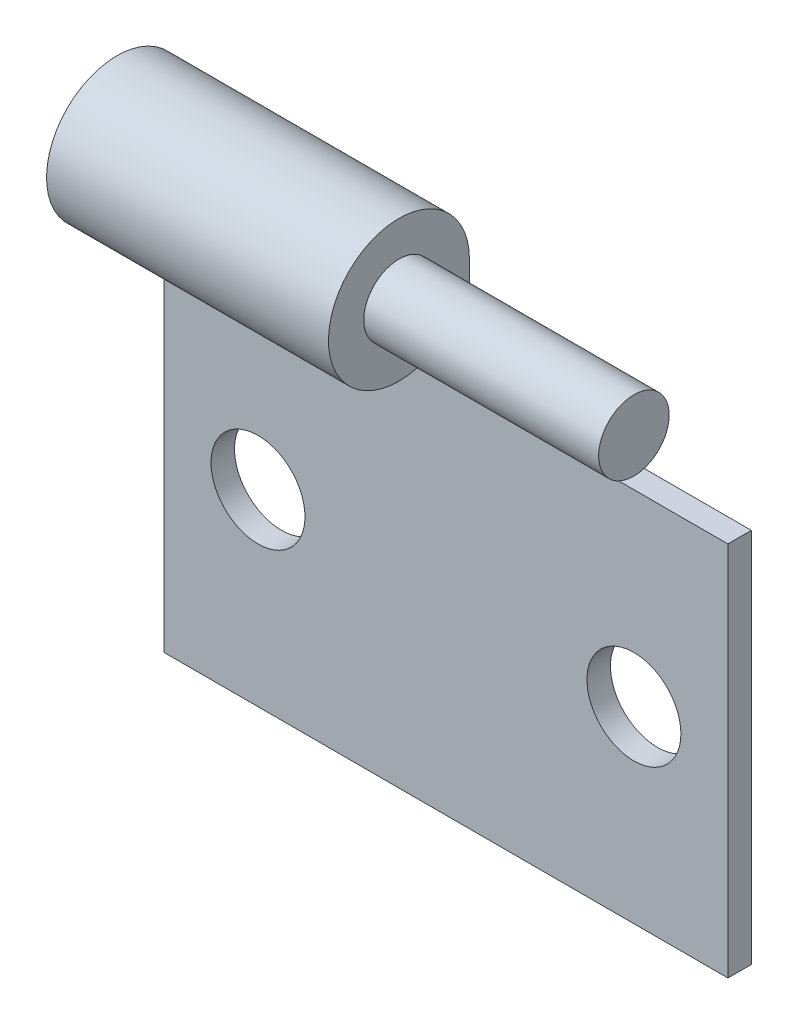
ISO-10303-21;
HEADER;
FILE_DESCRIPTION(('STEP AP214'),'2;1');
FILE_NAME('part.step','',(''),(''),'','','');
FILE_SCHEMA(('AUTOMOTIVE_DESIGN { 1 0 10303 214 1 1 1 1 }'));
ENDSEC;
DATA;
#1=APPLICATION_CONTEXT('core data for automotive mechanical design processes');
#2=APPLICATION_PROTOCOL_DEFINITION('international standard','automotive_design',2000,#1);
#3=PRODUCT_CONTEXT('',#1,'mechanical');
#4=PRODUCT('Part','Part','',(#3));
#5=PRODUCT_RELATED_PRODUCT_CATEGORY('part','',(#4));
#6=PRODUCT_DEFINITION_FORMATION('','',#4);
#7=PRODUCT_DEFINITION_CONTEXT('part definition',#1,'design');
#8=PRODUCT_DEFINITION('design','',#6,#7);
#9=PRODUCT_DEFINITION_SHAPE('','',#8);
#10=(LENGTH_UNIT() NAMED_UNIT(*) SI_UNIT(.MILLI.,.METRE.));
#11=(NAMED_UNIT(*) PLANE_ANGLE_UNIT() SI_UNIT($,.RADIAN.));
#12=(NAMED_UNIT(*) SI_UNIT($,.STERADIAN.) SOLID_ANGLE_UNIT());
#13=UNCERTAINTY_MEASURE_WITH_UNIT(LENGTH_MEASURE(1.E-05),#10,'distance_accuracy_value','');
#14=(GEOMETRIC_REPRESENTATION_CONTEXT(3) GLOBAL_UNCERTAINTY_ASSIGNED_CONTEXT((#13)) GLOBAL_UNIT_ASSIGNED_CONTEXT((#10,
#11,#12)) REPRESENTATION_CONTEXT('',''));
#15=CARTESIAN_POINT('',(0.,0.,0.));
#16=DIRECTION('',(0.,0.,1.));
#17=DIRECTION('',(1.,0.,0.));
#18=AXIS2_PLACEMENT_3D('',#15,#16,#17);
#19=CARTESIAN_POINT('',(-38.1,25.4,3.175));
#20=DIRECTION('',(0.,-1.,0.));
#21=DIRECTION('',(0.,0.,-1.));
#22=AXIS2_PLACEMENT_3D('',#19,#20,#21);
#23=PLANE('',#22);
#24=DIRECTION('',(0.,0.,-1.));
#25=VECTOR('',#24,1.);
#26=CARTESIAN_POINT('',(0.,25.4,3.175));
#27=LINE('',#26,#25);
#28=CARTESIAN_POINT('',(0.,25.4,3.175));
#29=VERTEX_POINT('',#28);
#30=CARTESIAN_POINT('',(0.,25.4,0.));
#31=VERTEX_POINT('',#30);
#32=EDGE_CURVE('E125',#29,#31,#27,.T.);
#33=ORIENTED_EDGE('',*,*,#32,.F.);
#34=DIRECTION('',(-1.,0.,0.));
#35=VECTOR('',#34,1.);
#36=CARTESIAN_POINT('',(-38.1,25.4,3.175));
#37=LINE('',#36,#35);
#38=CARTESIAN_POINT('',(38.1,25.4,3.175));
#39=VERTEX_POINT('',#38);
#40=EDGE_CURVE('E147',#39,#29,#37,.T.);
#41=ORIENTED_EDGE('',*,*,#40,.F.);
#42=DIRECTION('',(0.,0.,-1.));
#43=VECTOR('',#42,1.);
#44=CARTESIAN_POINT('',(38.1,25.4,3.175));
#45=LINE('',#44,#43);
#46=CARTESIAN_POINT('',(38.1,25.4,0.));
#47=VERTEX_POINT('',#46);
#48=EDGE_CURVE('E163',#39,#47,#45,.T.);
#49=ORIENTED_EDGE('',*,*,#48,.T.);
#50=DIRECTION('',(-1.,0.,0.));
#51=VECTOR('',#50,1.);
#52=CARTESIAN_POINT('',(-38.1,25.4,0.));
#53=LINE('',#52,#51);
#54=EDGE_CURVE('E104',#47,#31,#53,.T.);
#55=ORIENTED_EDGE('',*,*,#54,.T.);
#56=EDGE_LOOP('',(#33,#41,#49,#55));
#57=FACE_BOUND('',#56,.T.);
#58=ADVANCED_FACE('F35',(#57),#23,.F.);
#59=CARTESIAN_POINT('',(0.,0.,3.175));
#60=DIRECTION('',(0.,0.,-1.));
#61=DIRECTION('',(-1.,0.,0.));
#62=AXIS2_PLACEMENT_3D('',#59,#60,#61);
#63=PLANE('',#62);
#64=DIRECTION('',(0.,-1.,0.));
#65=VECTOR('',#64,1.);
#66=CARTESIAN_POINT('',(0.,25.4,3.175));
#67=LINE('',#66,#65);
#68=CARTESIAN_POINT('',(0.,25.8032778757914,3.175));
#69=VERTEX_POINT('',#68);
#70=EDGE_CURVE('E118',#69,#29,#67,.T.);
#71=ORIENTED_EDGE('',*,*,#70,.F.);
#72=DIRECTION('',(1.,0.,0.));
#73=VECTOR('',#72,1.);
#74=CARTESIAN_POINT('',(0.,25.8032778757914,3.175));
#75=LINE('',#74,#73);
#76=CARTESIAN_POINT('',(-38.1,25.8032778757914,3.175));
#77=VERTEX_POINT('',#76);
#78=EDGE_CURVE('E50',#69,#77,#75,.F.);
#79=ORIENTED_EDGE('',*,*,#78,.T.);
#80=DIRECTION('',(0.,-1.,0.));
#81=VECTOR('',#80,1.);
#82=CARTESIAN_POINT('',(-38.1,-25.4,3.175));
#83=LINE('',#82,#81);
#84=CARTESIAN_POINT('',(-38.1,-25.4,3.175));
#85=VERTEX_POINT('',#84);
#86=EDGE_CURVE('E150',#77,#85,#83,.T.);
#87=ORIENTED_EDGE('',*,*,#86,.T.);
#88=DIRECTION('',(1.,0.,0.));
#89=VECTOR('',#88,1.);
#90=CARTESIAN_POINT('',(-38.1,-25.4,3.175));
#91=LINE('',#90,#89);
#92=CARTESIAN_POINT('',(38.1,-25.4,3.175));
#93=VERTEX_POINT('',#92);
#94=EDGE_CURVE('E152',#85,#93,#91,.T.);
#95=ORIENTED_EDGE('',*,*,#94,.T.);
#96=DIRECTION('',(0.,1.,0.));
#97=VECTOR('',#96,1.);
#98=CARTESIAN_POINT('',(38.1,-25.4,3.175));
#99=LINE('',#98,#97);
#100=EDGE_CURVE('E144',#93,#39,#99,.T.);
#101=ORIENTED_EDGE('',*,*,#100,.T.);
#102=ORIENTED_EDGE('',*,*,#40,.T.);
#103=EDGE_LOOP('',(#71,#79,#87,#95,#101,#102));
#104=FACE_BOUND('',#103,.T.);
#105=CARTESIAN_POINT('',(-25.4,0.,3.175));
#106=DIRECTION('',(0.,0.,1.));
#107=DIRECTION('',(1.,0.,0.));
#108=AXIS2_PLACEMENT_3D('',#105,#106,#107);
#109=CIRCLE('',#108,6.35);
#110=CARTESIAN_POINT('',(-19.05,0.,3.175));
#111=VERTEX_POINT('',#110);
#112=EDGE_CURVE('E138',#111,#111,#109,.T.);
#113=ORIENTED_EDGE('',*,*,#112,.F.);
#114=EDGE_LOOP('',(#113));
#115=FACE_BOUND('',#114,.T.);
#116=CARTESIAN_POINT('',(25.4,0.,3.175));
#117=DIRECTION('',(0.,0.,1.));
#118=DIRECTION('',(1.,0.,0.));
#119=AXIS2_PLACEMENT_3D('',#116,#117,#118);
#120=CIRCLE('',#119,6.35);
#121=CARTESIAN_POINT('',(31.75,0.,3.175));
#122=VERTEX_POINT('',#121);
#123=EDGE_CURVE('E132',#122,#122,#120,.T.);
#124=ORIENTED_EDGE('',*,*,#123,.F.);
#125=EDGE_LOOP('',(#124));
#126=FACE_BOUND('',#125,.T.);
#127=ADVANCED_FACE('F192',(#104,#115,#126),#63,.F.);
#128=CARTESIAN_POINT('',(0.,0.,0.));
#129=DIRECTION('',(0.,0.,-1.));
#130=DIRECTION('',(-1.,0.,0.));
#131=AXIS2_PLACEMENT_3D('',#128,#129,#130);
#132=PLANE('',#131);
#133=CARTESIAN_POINT('',(-25.4,0.,0.));
#134=DIRECTION('',(0.,0.,1.));
#135=DIRECTION('',(1.,0.,0.));
#136=AXIS2_PLACEMENT_3D('',#133,#134,#135);
#137=CIRCLE('',#136,6.35);
#138=CARTESIAN_POINT('',(-19.05,0.,0.));
#139=VERTEX_POINT('',#138);
#140=EDGE_CURVE('E135',#139,#139,#137,.T.);
#141=ORIENTED_EDGE('',*,*,#140,.T.);
#142=EDGE_LOOP('',(#141));
#143=FACE_BOUND('',#142,.T.);
#144=DIRECTION('',(0.,1.,0.));
#145=VECTOR('',#144,1.);
#146=CARTESIAN_POINT('',(38.1,-25.4,0.));
#147=LINE('',#146,#145);
#148=CARTESIAN_POINT('',(38.1,-25.4,0.));
#149=VERTEX_POINT('',#148);
#150=EDGE_CURVE('E141',#149,#47,#147,.T.);
#151=ORIENTED_EDGE('',*,*,#150,.F.);
#152=DIRECTION('',(1.,0.,0.));
#153=VECTOR('',#152,1.);
#154=CARTESIAN_POINT('',(-38.1,-25.4,0.));
#155=LINE('',#154,#153);
#156=CARTESIAN_POINT('',(-38.1,-25.4,0.));
#157=VERTEX_POINT('',#156);
#158=EDGE_CURVE('E99',#157,#149,#155,.T.);
#159=ORIENTED_EDGE('',*,*,#158,.F.);
#160=DIRECTION('',(0.,-1.,0.));
#161=VECTOR('',#160,1.);
#162=CARTESIAN_POINT('',(-38.1,-25.4,0.));
#163=LINE('',#162,#161);
#164=CARTESIAN_POINT('',(-38.1,38.1,0.));
#165=VERTEX_POINT('',#164);
#166=EDGE_CURVE('E91',#165,#157,#163,.T.);
#167=ORIENTED_EDGE('',*,*,#166,.F.);
#168=DIRECTION('',(1.,0.,0.));
#169=VECTOR('',#168,1.);
#170=CARTESIAN_POINT('',(-38.1,38.1,0.));
#171=LINE('',#170,#169);
#172=CARTESIAN_POINT('',(0.,38.1,0.));
#173=VERTEX_POINT('',#172);
#174=EDGE_CURVE('E97',#165,#173,#171,.T.);
#175=ORIENTED_EDGE('',*,*,#174,.T.);
#176=DIRECTION('',(0.,1.,0.));
#177=VECTOR('',#176,1.);
#178=CARTESIAN_POINT('',(0.,38.1,0.));
#179=LINE('',#178,#177);
#180=EDGE_CURVE('E128',#31,#173,#179,.T.);
#181=ORIENTED_EDGE('',*,*,#180,.F.);
#182=ORIENTED_EDGE('',*,*,#54,.F.);
#183=EDGE_LOOP('',(#151,#159,#167,#175,#181,#182));
#184=FACE_BOUND('',#183,.T.);
#185=CARTESIAN_POINT('',(25.4,0.,0.));
#186=DIRECTION('',(0.,0.,1.));
#187=DIRECTION('',(1.,0.,0.));
#188=AXIS2_PLACEMENT_3D('',#185,#186,#187);
#189=CIRCLE('',#188,6.35);
#190=CARTESIAN_POINT('',(31.75,0.,0.));
#191=VERTEX_POINT('',#190);
#192=EDGE_CURVE('E114',#191,#191,#189,.T.);
#193=ORIENTED_EDGE('',*,*,#192,.T.);
#194=EDGE_LOOP('',(#193));
#195=FACE_BOUND('',#194,.T.);
#196=ADVANCED_FACE('F94',(#143,#184,#195),#132,.T.);
#197=CARTESIAN_POINT('',(38.1,-25.4,3.175));
#198=DIRECTION('',(-1.,0.,0.));
#199=DIRECTION('',(0.,0.,1.));
#200=AXIS2_PLACEMENT_3D('',#197,#198,#199);
#201=PLANE('',#200);
#202=ORIENTED_EDGE('',*,*,#150,.T.);
#203=ORIENTED_EDGE('',*,*,#48,.F.);
#204=ORIENTED_EDGE('',*,*,#100,.F.);
#205=DIRECTION('',(0.,0.,-1.));
#206=VECTOR('',#205,1.);
#207=CARTESIAN_POINT('',(38.1,-25.4,3.175));
#208=LINE('',#207,#206);
#209=EDGE_CURVE('E154',#93,#149,#208,.T.);
#210=ORIENTED_EDGE('',*,*,#209,.T.);
#211=EDGE_LOOP('',(#202,#203,#204,#210));
#212=FACE_BOUND('',#211,.T.);
#213=ADVANCED_FACE('F175',(#212),#201,.F.);
#214=CARTESIAN_POINT('',(-38.1,-25.4,3.175));
#215=DIRECTION('',(1.,0.,0.));
#216=DIRECTION('',(0.,0.,-1.));
#217=AXIS2_PLACEMENT_3D('',#214,#215,#216);
#218=PLANE('',#217);
#219=ORIENTED_EDGE('',*,*,#166,.T.);
#220=DIRECTION('',(0.,0.,-1.));
#221=VECTOR('',#220,1.);
#222=CARTESIAN_POINT('',(-38.1,-25.4,3.175));
#223=LINE('',#222,#221);
#224=EDGE_CURVE('E161',#85,#157,#223,.T.);
#225=ORIENTED_EDGE('',*,*,#224,.F.);
#226=ORIENTED_EDGE('',*,*,#86,.F.);
#227=CARTESIAN_POINT('',(-38.1,25.8032778757914,6.35));
#228=DIRECTION('',(1.,0.,0.));
#229=DIRECTION('',(0.,0.,-1.));
#230=AXIS2_PLACEMENT_3D('',#227,#228,#229);
#231=CIRCLE('',#230,3.175);
#232=CARTESIAN_POINT('',(-38.1,28.8774584068436,7.14375));
#233=VERTEX_POINT('',#232);
#234=EDGE_CURVE('E11',#77,#233,#231,.T.);
#235=ORIENTED_EDGE('',*,*,#234,.T.);
#236=CARTESIAN_POINT('',(-38.1,38.1,9.525));
#237=DIRECTION('',(1.,0.,0.));
#238=DIRECTION('',(0.,0.,-1.));
#239=AXIS2_PLACEMENT_3D('',#236,#237,#238);
#240=CIRCLE('',#239,9.525);
#241=EDGE_CURVE('E110',#165,#233,#240,.T.);
#242=ORIENTED_EDGE('',*,*,#241,.F.);
#243=EDGE_LOOP('',(#219,#225,#226,#235,#242));
#244=FACE_BOUND('',#243,.T.);
#245=ADVANCED_FACE('F116',(#244),#218,.F.);
#246=CARTESIAN_POINT('',(-38.1,-25.4,3.175));
#247=DIRECTION('',(0.,1.,0.));
#248=DIRECTION('',(0.,0.,1.));
#249=AXIS2_PLACEMENT_3D('',#246,#247,#248);
#250=PLANE('',#249);
#251=ORIENTED_EDGE('',*,*,#158,.T.);
#252=ORIENTED_EDGE('',*,*,#209,.F.);
#253=ORIENTED_EDGE('',*,*,#94,.F.);
#254=ORIENTED_EDGE('',*,*,#224,.T.);
#255=EDGE_LOOP('',(#251,#252,#253,#254));
#256=FACE_BOUND('',#255,.T.);
#257=ADVANCED_FACE('F179',(#256),#250,.F.);
#258=CARTESIAN_POINT('',(-25.4,0.,3.175));
#259=DIRECTION('',(0.,0.,-1.));
#260=DIRECTION('',(-1.,0.,0.));
#261=AXIS2_PLACEMENT_3D('',#258,#259,#260);
#262=CYLINDRICAL_SURFACE('',#261,6.35);
#263=ORIENTED_EDGE('',*,*,#112,.T.);
#264=EDGE_LOOP('',(#263));
#265=FACE_BOUND('',#264,.T.);
#266=ORIENTED_EDGE('',*,*,#140,.F.);
#267=EDGE_LOOP('',(#266));
#268=FACE_BOUND('',#267,.T.);
#269=ADVANCED_FACE('F211',(#265,#268),#262,.F.);
#270=CARTESIAN_POINT('',(25.4,0.,3.175));
#271=DIRECTION('',(0.,0.,-1.));
#272=DIRECTION('',(-1.,0.,0.));
#273=AXIS2_PLACEMENT_3D('',#270,#271,#272);
#274=CYLINDRICAL_SURFACE('',#273,6.35);
#275=ORIENTED_EDGE('',*,*,#123,.T.);
#276=EDGE_LOOP('',(#275));
#277=FACE_BOUND('',#276,.T.);
#278=ORIENTED_EDGE('',*,*,#192,.F.);
#279=EDGE_LOOP('',(#278));
#280=FACE_BOUND('',#279,.T.);
#281=ADVANCED_FACE('F215',(#277,#280),#274,.F.);
#282=CARTESIAN_POINT('',(-38.1,38.1,9.525));
#283=DIRECTION('',(1.,0.,0.));
#284=DIRECTION('',(0.,0.,-1.));
#285=AXIS2_PLACEMENT_3D('',#282,#283,#284);
#286=CYLINDRICAL_SURFACE('',#285,9.525);
#287=ORIENTED_EDGE('',*,*,#241,.T.);
#288=DIRECTION('',(1.,0.,0.));
#289=VECTOR('',#288,1.);
#290=CARTESIAN_POINT('',(-38.1,28.8774584068436,7.14375));
#291=LINE('',#290,#289);
#292=CARTESIAN_POINT('',(0.,28.8774584068436,7.14375));
#293=VERTEX_POINT('',#292);
#294=EDGE_CURVE('E166',#233,#293,#291,.T.);
#295=ORIENTED_EDGE('',*,*,#294,.T.);
#296=CARTESIAN_POINT('',(0.,38.1,9.525));
#297=DIRECTION('',(1.,0.,0.));
#298=DIRECTION('',(0.,0.,-1.));
#299=AXIS2_PLACEMENT_3D('',#296,#297,#298);
#300=CIRCLE('',#299,9.525);
#301=EDGE_CURVE('E112',#173,#293,#300,.T.);
#302=ORIENTED_EDGE('',*,*,#301,.F.);
#303=ORIENTED_EDGE('',*,*,#174,.F.);
#304=EDGE_LOOP('',(#287,#295,#302,#303));
#305=FACE_BOUND('',#304,.T.);
#306=ADVANCED_FACE('F108',(#305),#286,.T.);
#307=CARTESIAN_POINT('',(0.,38.1,9.525));
#308=DIRECTION('',(1.,0.,0.));
#309=DIRECTION('',(0.,0.,-1.));
#310=AXIS2_PLACEMENT_3D('',#307,#308,#309);
#311=PLANE('',#310);
#312=CARTESIAN_POINT('',(0.,38.1,9.525));
#313=DIRECTION('',(1.,0.,0.));
#314=DIRECTION('',(0.,0.,-1.));
#315=AXIS2_PLACEMENT_3D('',#312,#313,#314);
#316=CIRCLE('',#315,4.7625);
#317=CARTESIAN_POINT('',(0.,38.1,4.7625));
#318=VERTEX_POINT('',#317);
#319=EDGE_CURVE('E123',#318,#318,#316,.T.);
#320=ORIENTED_EDGE('',*,*,#319,.F.);
#321=EDGE_LOOP('',(#320));
#322=FACE_BOUND('',#321,.T.);
#323=ORIENTED_EDGE('',*,*,#32,.T.);
#324=ORIENTED_EDGE('',*,*,#180,.T.);
#325=ORIENTED_EDGE('',*,*,#301,.T.);
#326=CARTESIAN_POINT('',(0.,25.8032778757914,6.35));
#327=DIRECTION('',(1.,0.,0.));
#328=DIRECTION('',(0.,0.,-1.));
#329=AXIS2_PLACEMENT_3D('',#326,#327,#328);
#330=CIRCLE('',#329,3.175);
#331=EDGE_CURVE('E43',#293,#69,#330,.F.);
#332=ORIENTED_EDGE('',*,*,#331,.T.);
#333=ORIENTED_EDGE('',*,*,#70,.T.);
#334=EDGE_LOOP('',(#323,#324,#325,#332,#333));
#335=FACE_BOUND('',#334,.T.);
#336=ADVANCED_FACE('F169',(#322,#335),#311,.T.);
#337=CARTESIAN_POINT('',(-38.1,25.8032778757914,6.35));
#338=DIRECTION('',(1.,0.,0.));
#339=DIRECTION('',(0.,0.,-1.));
#340=AXIS2_PLACEMENT_3D('',#337,#338,#339);
#341=CYLINDRICAL_SURFACE('',#340,3.175);
#342=ORIENTED_EDGE('',*,*,#234,.F.);
#343=ORIENTED_EDGE('',*,*,#78,.F.);
#344=ORIENTED_EDGE('',*,*,#331,.F.);
#345=ORIENTED_EDGE('',*,*,#294,.F.);
#346=EDGE_LOOP('',(#342,#343,#344,#345));
#347=FACE_BOUND('',#346,.T.);
#348=ADVANCED_FACE('F37',(#347),#341,.F.);
#349=CARTESIAN_POINT('',(31.75,38.1,9.525));
#350=DIRECTION('',(-1.,0.,0.));
#351=DIRECTION('',(0.,0.,1.));
#352=AXIS2_PLACEMENT_3D('',#349,#350,#351);
#353=CYLINDRICAL_SURFACE('',#352,4.7625);
#354=CARTESIAN_POINT('',(31.75,38.1,9.525));
#355=DIRECTION('',(1.,0.,0.));
#356=DIRECTION('',(0.,0.,-1.));
#357=AXIS2_PLACEMENT_3D('',#354,#355,#356);
#358=CIRCLE('',#357,4.7625);
#359=CARTESIAN_POINT('',(31.75,38.1,4.7625));
#360=VERTEX_POINT('',#359);
#361=EDGE_CURVE('E129',#360,#360,#358,.T.);
#362=ORIENTED_EDGE('',*,*,#361,.F.);
#363=EDGE_LOOP('',(#362));
#364=FACE_BOUND('',#363,.T.);
#365=ORIENTED_EDGE('',*,*,#319,.T.);
#366=EDGE_LOOP('',(#365));
#367=FACE_BOUND('',#366,.T.);
#368=ADVANCED_FACE('F181',(#364,#367),#353,.T.);
#369=CARTESIAN_POINT('',(31.75,38.1,9.525));
#370=DIRECTION('',(1.,0.,0.));
#371=DIRECTION('',(0.,0.,-1.));
#372=AXIS2_PLACEMENT_3D('',#369,#370,#371);
#373=PLANE('',#372);
#374=ORIENTED_EDGE('',*,*,#361,.T.);
#375=EDGE_LOOP('',(#374));
#376=FACE_BOUND('',#375,.T.);
#377=ADVANCED_FACE('F186',(#376),#373,.T.);
#378=CLOSED_SHELL('',(#58,#127,#196,#213,#245,#257,#269,#281,#306,#336,#348,#368,#377));
#379=MANIFOLD_SOLID_BREP('B2',#378);
#380=ADVANCED_BREP_SHAPE_REPRESENTATION('',(#18,#379),#14);
#381=SHAPE_DEFINITION_REPRESENTATION(#9,#380);
ENDSEC;
END-ISO-10303-21;
